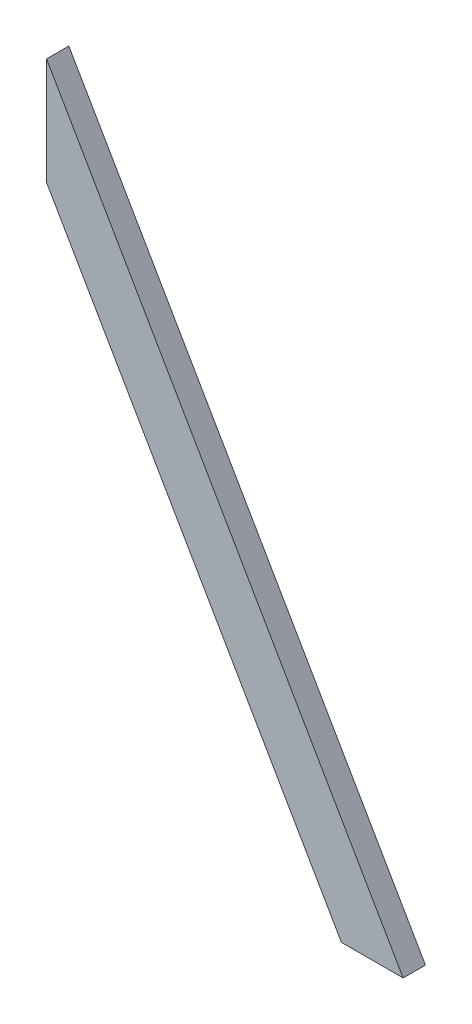
ISO-10303-21;
HEADER;
FILE_DESCRIPTION(('STEP AP214'),'2;1');
FILE_NAME('part.step','',(''),(''),'','','');
FILE_SCHEMA(('AUTOMOTIVE_DESIGN { 1 0 10303 214 1 1 1 1 }'));
ENDSEC;
DATA;
#1=APPLICATION_CONTEXT('core data for automotive mechanical design processes');
#2=APPLICATION_PROTOCOL_DEFINITION('international standard','automotive_design',2000,#1);
#3=PRODUCT_CONTEXT('',#1,'mechanical');
#4=PRODUCT('Part','Part','',(#3));
#5=PRODUCT_RELATED_PRODUCT_CATEGORY('part','',(#4));
#6=PRODUCT_DEFINITION_FORMATION('','',#4);
#7=PRODUCT_DEFINITION_CONTEXT('part definition',#1,'design');
#8=PRODUCT_DEFINITION('design','',#6,#7);
#9=PRODUCT_DEFINITION_SHAPE('','',#8);
#10=(LENGTH_UNIT() NAMED_UNIT(*) SI_UNIT(.MILLI.,.METRE.));
#11=(NAMED_UNIT(*) PLANE_ANGLE_UNIT() SI_UNIT($,.RADIAN.));
#12=(NAMED_UNIT(*) SI_UNIT($,.STERADIAN.) SOLID_ANGLE_UNIT());
#13=UNCERTAINTY_MEASURE_WITH_UNIT(LENGTH_MEASURE(1.E-05),#10,'distance_accuracy_value','');
#14=(GEOMETRIC_REPRESENTATION_CONTEXT(3) GLOBAL_UNCERTAINTY_ASSIGNED_CONTEXT((#13)) GLOBAL_UNIT_ASSIGNED_CONTEXT((#10,
#11,#12)) REPRESENTATION_CONTEXT('',''));
#15=CARTESIAN_POINT('',(0.,0.,0.));
#16=DIRECTION('',(0.,0.,1.));
#17=DIRECTION('',(1.,0.,0.));
#18=AXIS2_PLACEMENT_3D('',#15,#16,#17);
#19=CARTESIAN_POINT('',(69.2820323027551,0.,25.));
#20=DIRECTION('',(0.,1.,0.));
#21=DIRECTION('',(0.,0.,1.));
#22=AXIS2_PLACEMENT_3D('',#19,#20,#21);
#23=PLANE('',#22);
#24=DIRECTION('',(1.,0.,0.));
#25=VECTOR('',#24,1.);
#26=CARTESIAN_POINT('',(69.2820323027551,0.,0.));
#27=LINE('',#26,#25);
#28=CARTESIAN_POINT('',(0.,0.,0.));
#29=VERTEX_POINT('',#28);
#30=CARTESIAN_POINT('',(69.2820323027551,0.,0.));
#31=VERTEX_POINT('',#30);
#32=EDGE_CURVE('E95',#29,#31,#27,.T.);
#33=ORIENTED_EDGE('',*,*,#32,.T.);
#34=DIRECTION('',(0.,0.,-1.));
#35=VECTOR('',#34,1.);
#36=CARTESIAN_POINT('',(69.2820323027551,0.,25.));
#37=LINE('',#36,#35);
#38=CARTESIAN_POINT('',(69.2820323027551,0.,25.));
#39=VERTEX_POINT('',#38);
#40=EDGE_CURVE('E11',#39,#31,#37,.T.);
#41=ORIENTED_EDGE('',*,*,#40,.F.);
#42=DIRECTION('',(1.,0.,0.));
#43=VECTOR('',#42,1.);
#44=CARTESIAN_POINT('',(69.2820323027551,0.,25.));
#45=LINE('',#44,#43);
#46=CARTESIAN_POINT('',(0.,0.,25.));
#47=VERTEX_POINT('',#46);
#48=EDGE_CURVE('E83',#47,#39,#45,.T.);
#49=ORIENTED_EDGE('',*,*,#48,.F.);
#50=DIRECTION('',(0.,0.,-1.));
#51=VECTOR('',#50,1.);
#52=CARTESIAN_POINT('',(0.,0.,25.));
#53=LINE('',#52,#51);
#54=EDGE_CURVE('E91',#47,#29,#53,.T.);
#55=ORIENTED_EDGE('',*,*,#54,.T.);
#56=EDGE_LOOP('',(#33,#41,#49,#55));
#57=FACE_BOUND('',#56,.T.);
#58=ADVANCED_FACE('F32',(#57),#23,.F.);
#59=CARTESIAN_POINT('',(-330.717967697248,692.820323027549,25.));
#60=DIRECTION('',(-0.866025403784436,-0.500000000000004,0.));
#61=DIRECTION('',(0.500000000000004,-0.866025403784436,0.));
#62=AXIS2_PLACEMENT_3D('',#59,#60,#61);
#63=PLANE('',#62);
#64=DIRECTION('',(-0.500000000000004,0.866025403784436,0.));
#65=VECTOR('',#64,1.);
#66=CARTESIAN_POINT('',(-330.717967697248,692.820323027549,0.));
#67=LINE('',#66,#65);
#68=CARTESIAN_POINT('',(-330.717967697248,692.820323027549,0.));
#69=VERTEX_POINT('',#68);
#70=EDGE_CURVE('E87',#31,#69,#67,.T.);
#71=ORIENTED_EDGE('',*,*,#70,.T.);
#72=DIRECTION('',(0.,0.,-1.));
#73=VECTOR('',#72,1.);
#74=CARTESIAN_POINT('',(-330.717967697248,692.820323027549,25.));
#75=LINE('',#74,#73);
#76=CARTESIAN_POINT('',(-330.717967697248,692.820323027549,25.));
#77=VERTEX_POINT('',#76);
#78=EDGE_CURVE('E40',#77,#69,#75,.T.);
#79=ORIENTED_EDGE('',*,*,#78,.F.);
#80=DIRECTION('',(-0.500000000000004,0.866025403784436,0.));
#81=VECTOR('',#80,1.);
#82=CARTESIAN_POINT('',(-330.717967697248,692.820323027549,25.));
#83=LINE('',#82,#81);
#84=EDGE_CURVE('E78',#39,#77,#83,.T.);
#85=ORIENTED_EDGE('',*,*,#84,.F.);
#86=ORIENTED_EDGE('',*,*,#40,.T.);
#87=EDGE_LOOP('',(#71,#79,#85,#86));
#88=FACE_BOUND('',#87,.T.);
#89=ADVANCED_FACE('F86',(#88),#63,.F.);
#90=CARTESIAN_POINT('',(-330.717967697248,572.82032302755,25.));
#91=DIRECTION('',(1.,0.,0.));
#92=DIRECTION('',(0.,0.,-1.));
#93=AXIS2_PLACEMENT_3D('',#90,#91,#92);
#94=PLANE('',#93);
#95=DIRECTION('',(0.,-1.,0.));
#96=VECTOR('',#95,1.);
#97=CARTESIAN_POINT('',(-330.717967697248,572.82032302755,0.));
#98=LINE('',#97,#96);
#99=CARTESIAN_POINT('',(-330.717967697248,572.82032302755,0.));
#100=VERTEX_POINT('',#99);
#101=EDGE_CURVE('E65',#69,#100,#98,.T.);
#102=ORIENTED_EDGE('',*,*,#101,.T.);
#103=DIRECTION('',(0.,0.,-1.));
#104=VECTOR('',#103,1.);
#105=CARTESIAN_POINT('',(-330.717967697248,572.82032302755,25.));
#106=LINE('',#105,#104);
#107=CARTESIAN_POINT('',(-330.717967697248,572.82032302755,25.));
#108=VERTEX_POINT('',#107);
#109=EDGE_CURVE('E88',#108,#100,#106,.T.);
#110=ORIENTED_EDGE('',*,*,#109,.F.);
#111=DIRECTION('',(0.,-1.,0.));
#112=VECTOR('',#111,1.);
#113=CARTESIAN_POINT('',(-330.717967697248,572.82032302755,25.));
#114=LINE('',#113,#112);
#115=EDGE_CURVE('E81',#77,#108,#114,.T.);
#116=ORIENTED_EDGE('',*,*,#115,.F.);
#117=ORIENTED_EDGE('',*,*,#78,.T.);
#118=EDGE_LOOP('',(#102,#110,#116,#117));
#119=FACE_BOUND('',#118,.T.);
#120=ADVANCED_FACE('F89',(#119),#94,.F.);
#121=CARTESIAN_POINT('',(0.,0.,25.));
#122=DIRECTION('',(0.866025403784436,0.500000000000004,0.));
#123=DIRECTION('',(-0.500000000000005,0.866025403784436,0.));
#124=AXIS2_PLACEMENT_3D('',#121,#122,#123);
#125=PLANE('',#124);
#126=DIRECTION('',(0.500000000000004,-0.866025403784436,0.));
#127=VECTOR('',#126,1.);
#128=CARTESIAN_POINT('',(0.,0.,0.));
#129=LINE('',#128,#127);
#130=EDGE_CURVE('E71',#100,#29,#129,.T.);
#131=ORIENTED_EDGE('',*,*,#130,.T.);
#132=ORIENTED_EDGE('',*,*,#54,.F.);
#133=DIRECTION('',(0.500000000000004,-0.866025403784436,0.));
#134=VECTOR('',#133,1.);
#135=CARTESIAN_POINT('',(0.,0.,25.));
#136=LINE('',#135,#134);
#137=EDGE_CURVE('E48',#108,#47,#136,.T.);
#138=ORIENTED_EDGE('',*,*,#137,.F.);
#139=ORIENTED_EDGE('',*,*,#109,.T.);
#140=EDGE_LOOP('',(#131,#132,#138,#139));
#141=FACE_BOUND('',#140,.T.);
#142=ADVANCED_FACE('F102',(#141),#125,.F.);
#143=CARTESIAN_POINT('',(0.,0.,25.));
#144=DIRECTION('',(0.,0.,-1.));
#145=DIRECTION('',(-1.,0.,0.));
#146=AXIS2_PLACEMENT_3D('',#143,#144,#145);
#147=PLANE('',#146);
#148=ORIENTED_EDGE('',*,*,#48,.T.);
#149=ORIENTED_EDGE('',*,*,#84,.T.);
#150=ORIENTED_EDGE('',*,*,#115,.T.);
#151=ORIENTED_EDGE('',*,*,#137,.T.);
#152=EDGE_LOOP('',(#148,#149,#150,#151));
#153=FACE_BOUND('',#152,.T.);
#154=ADVANCED_FACE('F79',(#153),#147,.F.);
#155=CARTESIAN_POINT('',(0.,0.,0.));
#156=DIRECTION('',(0.,0.,-1.));
#157=DIRECTION('',(-1.,0.,0.));
#158=AXIS2_PLACEMENT_3D('',#155,#156,#157);
#159=PLANE('',#158);
#160=ORIENTED_EDGE('',*,*,#32,.F.);
#161=ORIENTED_EDGE('',*,*,#130,.F.);
#162=ORIENTED_EDGE('',*,*,#101,.F.);
#163=ORIENTED_EDGE('',*,*,#70,.F.);
#164=EDGE_LOOP('',(#160,#161,#162,#163));
#165=FACE_BOUND('',#164,.T.);
#166=ADVANCED_FACE('F105',(#165),#159,.T.);
#167=CLOSED_SHELL('',(#58,#89,#120,#142,#154,#166));
#168=MANIFOLD_SOLID_BREP('B2',#167);
#169=ADVANCED_BREP_SHAPE_REPRESENTATION('',(#18,#168),#14);
#170=SHAPE_DEFINITION_REPRESENTATION(#9,#169);
ENDSEC;
END-ISO-10303-21;
